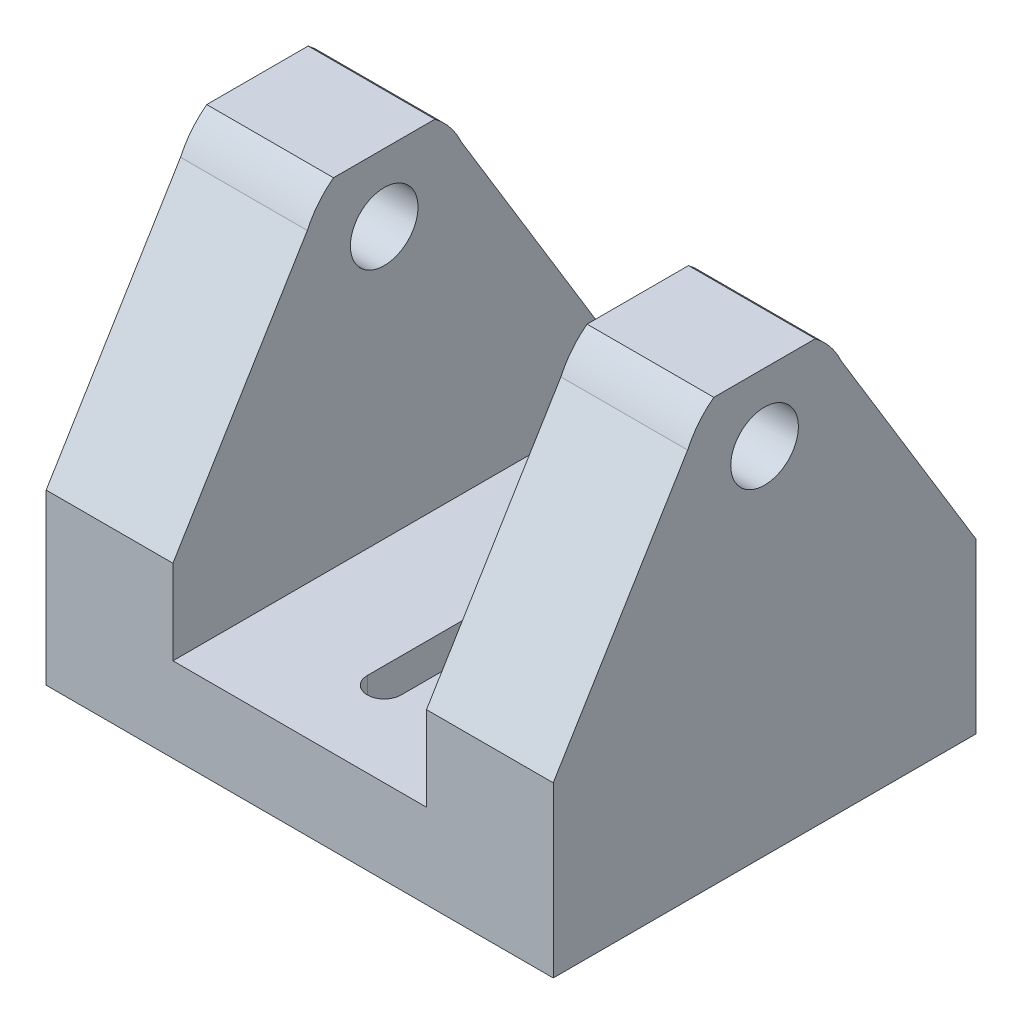
ISO-10303-21;
HEADER;
FILE_DESCRIPTION(('STEP AP214'),'2;1');
FILE_NAME('part.step','',(''),(''),'','','');
FILE_SCHEMA(('AUTOMOTIVE_DESIGN { 1 0 10303 214 1 1 1 1 }'));
ENDSEC;
DATA;
#1=APPLICATION_CONTEXT('core data for automotive mechanical design processes');
#2=APPLICATION_PROTOCOL_DEFINITION('international standard','automotive_design',2000,#1);
#3=PRODUCT_CONTEXT('',#1,'mechanical');
#4=PRODUCT('Part','Part','',(#3));
#5=PRODUCT_RELATED_PRODUCT_CATEGORY('part','',(#4));
#6=PRODUCT_DEFINITION_FORMATION('','',#4);
#7=PRODUCT_DEFINITION_CONTEXT('part definition',#1,'design');
#8=PRODUCT_DEFINITION('design','',#6,#7);
#9=PRODUCT_DEFINITION_SHAPE('','',#8);
#10=(LENGTH_UNIT() NAMED_UNIT(*) SI_UNIT(.MILLI.,.METRE.));
#11=(NAMED_UNIT(*) PLANE_ANGLE_UNIT() SI_UNIT($,.RADIAN.));
#12=(NAMED_UNIT(*) SI_UNIT($,.STERADIAN.) SOLID_ANGLE_UNIT());
#13=UNCERTAINTY_MEASURE_WITH_UNIT(LENGTH_MEASURE(1.E-05),#10,'distance_accuracy_value','');
#14=(GEOMETRIC_REPRESENTATION_CONTEXT(3) GLOBAL_UNCERTAINTY_ASSIGNED_CONTEXT((#13)) GLOBAL_UNIT_ASSIGNED_CONTEXT((#10,
#11,#12)) REPRESENTATION_CONTEXT('',''));
#15=CARTESIAN_POINT('',(0.,0.,0.));
#16=DIRECTION('',(0.,0.,1.));
#17=DIRECTION('',(1.,0.,0.));
#18=AXIS2_PLACEMENT_3D('',#15,#16,#17);
#19=CARTESIAN_POINT('',(0.,63.5,0.));
#20=DIRECTION('',(1.,0.,0.));
#21=DIRECTION('',(0.,0.,-1.));
#22=AXIS2_PLACEMENT_3D('',#19,#20,#21);
#23=PLANE('',#22);
#24=DIRECTION('',(0.,-0.854416285186458,-0.519589079569782));
#25=VECTOR('',#24,1.);
#26=CARTESIAN_POINT('',(0.,35.0478404853786,-57.6329388910934));
#27=LINE('',#26,#25);
#28=CARTESIAN_POINT('',(0.,58.6055247601735,-43.307));
#29=VERTEX_POINT('',#28);
#30=CARTESIAN_POINT('',(0.,25.4,-63.5));
#31=VERTEX_POINT('',#30);
#32=EDGE_CURVE('E286',#29,#31,#27,.T.);
#33=ORIENTED_EDGE('',*,*,#32,.T.);
#34=DIRECTION('',(0.,-1.,0.));
#35=VECTOR('',#34,1.);
#36=CARTESIAN_POINT('',(0.,63.5,-63.5));
#37=LINE('',#36,#35);
#38=CARTESIAN_POINT('',(0.,0.,-63.5));
#39=VERTEX_POINT('',#38);
#40=EDGE_CURVE('E229',#31,#39,#37,.T.);
#41=ORIENTED_EDGE('',*,*,#40,.T.);
#42=DIRECTION('',(0.,0.,1.));
#43=VECTOR('',#42,1.);
#44=CARTESIAN_POINT('',(0.,0.,0.));
#45=LINE('',#44,#43);
#46=CARTESIAN_POINT('',(0.,0.,0.));
#47=VERTEX_POINT('',#46);
#48=EDGE_CURVE('E226',#39,#47,#45,.T.);
#49=ORIENTED_EDGE('',*,*,#48,.T.);
#50=DIRECTION('',(0.,-1.,0.));
#51=VECTOR('',#50,1.);
#52=CARTESIAN_POINT('',(0.,63.5,0.));
#53=LINE('',#52,#51);
#54=CARTESIAN_POINT('',(0.,25.4,0.));
#55=VERTEX_POINT('',#54);
#56=EDGE_CURVE('E239',#55,#47,#53,.T.);
#57=ORIENTED_EDGE('',*,*,#56,.F.);
#58=DIRECTION('',(0.,-0.854416285186458,0.519589079569782));
#59=VECTOR('',#58,1.);
#60=CARTESIAN_POINT('',(0.,6.8573094148476,11.2762124282124));
#61=LINE('',#60,#59);
#62=CARTESIAN_POINT('',(0.,58.6055247601735,-20.193));
#63=VERTEX_POINT('',#62);
#64=EDGE_CURVE('E272',#63,#55,#61,.T.);
#65=ORIENTED_EDGE('',*,*,#64,.F.);
#66=CARTESIAN_POINT('',(0.,53.34,-31.75));
#67=DIRECTION('',(-1.,0.,0.));
#68=DIRECTION('',(0.,0.,1.));
#69=AXIS2_PLACEMENT_3D('',#66,#67,#68);
#70=CIRCLE('',#69,12.7);
#71=CARTESIAN_POINT('',(0.,63.5,-24.13));
#72=VERTEX_POINT('',#71);
#73=EDGE_CURVE('E269',#72,#63,#70,.F.);
#74=ORIENTED_EDGE('',*,*,#73,.F.);
#75=DIRECTION('',(0.,0.,1.));
#76=VECTOR('',#75,1.);
#77=CARTESIAN_POINT('',(0.,63.5,0.));
#78=LINE('',#77,#76);
#79=CARTESIAN_POINT('',(0.,63.5,-39.37));
#80=VERTEX_POINT('',#79);
#81=EDGE_CURVE('E227',#80,#72,#78,.T.);
#82=ORIENTED_EDGE('',*,*,#81,.F.);
#83=CARTESIAN_POINT('',(0.,53.34,-31.75));
#84=DIRECTION('',(-1.,0.,0.));
#85=DIRECTION('',(0.,0.,1.));
#86=AXIS2_PLACEMENT_3D('',#83,#84,#85);
#87=CIRCLE('',#86,12.7);
#88=EDGE_CURVE('E181',#29,#80,#87,.F.);
#89=ORIENTED_EDGE('',*,*,#88,.F.);
#90=EDGE_LOOP('',(#33,#41,#49,#57,#65,#74,#82,#89));
#91=FACE_BOUND('',#90,.T.);
#92=CARTESIAN_POINT('',(0.,53.34,-31.75));
#93=DIRECTION('',(-1.,0.,0.));
#94=DIRECTION('',(0.,0.,1.));
#95=AXIS2_PLACEMENT_3D('',#92,#93,#94);
#96=CIRCLE('',#95,5.08);
#97=CARTESIAN_POINT('',(0.,53.34,-26.67));
#98=VERTEX_POINT('',#97);
#99=EDGE_CURVE('E300',#98,#98,#96,.T.);
#100=ORIENTED_EDGE('',*,*,#99,.F.);
#101=EDGE_LOOP('',(#100));
#102=FACE_BOUND('',#101,.T.);
#103=ADVANCED_FACE('F33',(#91,#102),#23,.F.);
#104=CARTESIAN_POINT('',(0.,63.5,-63.5));
#105=DIRECTION('',(0.,0.,1.));
#106=DIRECTION('',(1.,0.,0.));
#107=AXIS2_PLACEMENT_3D('',#104,#105,#106);
#108=PLANE('',#107);
#109=DIRECTION('',(-1.,0.,0.));
#110=VECTOR('',#109,1.);
#111=CARTESIAN_POINT('',(76.2,25.4,-63.5));
#112=LINE('',#111,#110);
#113=CARTESIAN_POINT('',(76.2,25.4,-63.5));
#114=VERTEX_POINT('',#113);
#115=CARTESIAN_POINT('',(57.15,25.4,-63.5));
#116=VERTEX_POINT('',#115);
#117=EDGE_CURVE('E296',#114,#116,#112,.T.);
#118=ORIENTED_EDGE('',*,*,#117,.F.);
#119=DIRECTION('',(0.,-1.,0.));
#120=VECTOR('',#119,1.);
#121=CARTESIAN_POINT('',(76.2,63.5,-63.5));
#122=LINE('',#121,#120);
#123=CARTESIAN_POINT('',(76.2,0.,-63.5));
#124=VERTEX_POINT('',#123);
#125=EDGE_CURVE('E224',#114,#124,#122,.T.);
#126=ORIENTED_EDGE('',*,*,#125,.T.);
#127=DIRECTION('',(-1.,0.,0.));
#128=VECTOR('',#127,1.);
#129=CARTESIAN_POINT('',(0.,0.,-63.5));
#130=LINE('',#129,#128);
#131=EDGE_CURVE('E230',#124,#39,#130,.T.);
#132=ORIENTED_EDGE('',*,*,#131,.T.);
#133=ORIENTED_EDGE('',*,*,#40,.F.);
#134=CARTESIAN_POINT('',(19.05,25.4,-63.5));
#135=VERTEX_POINT('',#134);
#136=EDGE_CURVE('E341',#135,#31,#112,.T.);
#137=ORIENTED_EDGE('',*,*,#136,.F.);
#138=DIRECTION('',(0.,-1.,0.));
#139=VECTOR('',#138,1.);
#140=CARTESIAN_POINT('',(19.05,63.5,-63.5));
#141=LINE('',#140,#139);
#142=CARTESIAN_POINT('',(19.05,12.7,-63.5));
#143=VERTEX_POINT('',#142);
#144=EDGE_CURVE('E216',#135,#143,#141,.T.);
#145=ORIENTED_EDGE('',*,*,#144,.T.);
#146=DIRECTION('',(-1.,0.,0.));
#147=VECTOR('',#146,1.);
#148=CARTESIAN_POINT('',(57.15,12.7,-63.5));
#149=LINE('',#148,#147);
#150=CARTESIAN_POINT('',(57.15,12.7,-63.5));
#151=VERTEX_POINT('',#150);
#152=EDGE_CURVE('E308',#151,#143,#149,.T.);
#153=ORIENTED_EDGE('',*,*,#152,.F.);
#154=DIRECTION('',(0.,-1.,0.));
#155=VECTOR('',#154,1.);
#156=CARTESIAN_POINT('',(57.15,63.5,-63.5));
#157=LINE('',#156,#155);
#158=EDGE_CURVE('E311',#116,#151,#157,.T.);
#159=ORIENTED_EDGE('',*,*,#158,.F.);
#160=EDGE_LOOP('',(#118,#126,#132,#133,#137,#145,#153,#159));
#161=FACE_BOUND('',#160,.T.);
#162=ADVANCED_FACE('F338',(#161),#108,.F.);
#163=CARTESIAN_POINT('',(76.2,63.5,0.));
#164=DIRECTION('',(1.,0.,0.));
#165=DIRECTION('',(0.,0.,-1.));
#166=AXIS2_PLACEMENT_3D('',#163,#164,#165);
#167=PLANE('',#166);
#168=CARTESIAN_POINT('',(76.2,53.34,-31.75));
#169=DIRECTION('',(-1.,0.,0.));
#170=DIRECTION('',(0.,0.,1.));
#171=AXIS2_PLACEMENT_3D('',#168,#169,#170);
#172=CIRCLE('',#171,5.08);
#173=CARTESIAN_POINT('',(76.2,53.34,-26.67));
#174=VERTEX_POINT('',#173);
#175=EDGE_CURVE('E246',#174,#174,#172,.T.);
#176=ORIENTED_EDGE('',*,*,#175,.T.);
#177=EDGE_LOOP('',(#176));
#178=FACE_BOUND('',#177,.T.);
#179=ORIENTED_EDGE('',*,*,#125,.F.);
#180=DIRECTION('',(0.,-0.854416285186458,-0.519589079569782));
#181=VECTOR('',#180,1.);
#182=CARTESIAN_POINT('',(76.2,35.0478404853786,-57.6329388910934));
#183=LINE('',#182,#181);
#184=CARTESIAN_POINT('',(76.2,58.6055247601735,-43.307));
#185=VERTEX_POINT('',#184);
#186=EDGE_CURVE('E371',#185,#114,#183,.T.);
#187=ORIENTED_EDGE('',*,*,#186,.F.);
#188=CARTESIAN_POINT('',(76.2,53.34,-31.75));
#189=DIRECTION('',(-1.,0.,0.));
#190=DIRECTION('',(0.,0.,1.));
#191=AXIS2_PLACEMENT_3D('',#188,#189,#190);
#192=CIRCLE('',#191,12.7);
#193=CARTESIAN_POINT('',(76.2,63.5,-39.37));
#194=VERTEX_POINT('',#193);
#195=EDGE_CURVE('E373',#185,#194,#192,.F.);
#196=ORIENTED_EDGE('',*,*,#195,.T.);
#197=DIRECTION('',(0.,0.,1.));
#198=VECTOR('',#197,1.);
#199=CARTESIAN_POINT('',(76.2,63.5,0.));
#200=LINE('',#199,#198);
#201=CARTESIAN_POINT('',(76.2,63.5,-24.13));
#202=VERTEX_POINT('',#201);
#203=EDGE_CURVE('E217',#194,#202,#200,.T.);
#204=ORIENTED_EDGE('',*,*,#203,.T.);
#205=CARTESIAN_POINT('',(76.2,53.34,-31.75));
#206=DIRECTION('',(-1.,0.,0.));
#207=DIRECTION('',(0.,0.,1.));
#208=AXIS2_PLACEMENT_3D('',#205,#206,#207);
#209=CIRCLE('',#208,12.7);
#210=CARTESIAN_POINT('',(76.2,58.6055247601735,-20.193));
#211=VERTEX_POINT('',#210);
#212=EDGE_CURVE('E277',#202,#211,#209,.F.);
#213=ORIENTED_EDGE('',*,*,#212,.T.);
#214=DIRECTION('',(0.,-0.854416285186458,0.519589079569782));
#215=VECTOR('',#214,1.);
#216=CARTESIAN_POINT('',(76.2,6.8573094148476,11.2762124282124));
#217=LINE('',#216,#215);
#218=CARTESIAN_POINT('',(76.2,25.4,0.));
#219=VERTEX_POINT('',#218);
#220=EDGE_CURVE('E280',#211,#219,#217,.T.);
#221=ORIENTED_EDGE('',*,*,#220,.T.);
#222=DIRECTION('',(0.,-1.,0.));
#223=VECTOR('',#222,1.);
#224=CARTESIAN_POINT('',(76.2,63.5,0.));
#225=LINE('',#224,#223);
#226=CARTESIAN_POINT('',(76.2,0.,0.));
#227=VERTEX_POINT('',#226);
#228=EDGE_CURVE('E220',#219,#227,#225,.T.);
#229=ORIENTED_EDGE('',*,*,#228,.T.);
#230=DIRECTION('',(0.,0.,1.));
#231=VECTOR('',#230,1.);
#232=CARTESIAN_POINT('',(76.2,0.,0.));
#233=LINE('',#232,#231);
#234=EDGE_CURVE('E207',#124,#227,#233,.T.);
#235=ORIENTED_EDGE('',*,*,#234,.F.);
#236=EDGE_LOOP('',(#179,#187,#196,#204,#213,#221,#229,#235));
#237=FACE_BOUND('',#236,.T.);
#238=ADVANCED_FACE('F368',(#178,#237),#167,.T.);
#239=CARTESIAN_POINT('',(19.05,63.5,-63.5));
#240=DIRECTION('',(-1.,0.,0.));
#241=DIRECTION('',(0.,0.,1.));
#242=AXIS2_PLACEMENT_3D('',#239,#240,#241);
#243=PLANE('',#242);
#244=DIRECTION('',(0.,-0.854416285186458,-0.519589079569782));
#245=VECTOR('',#244,1.);
#246=CARTESIAN_POINT('',(19.05,53.2140358777286,-46.5856813576814));
#247=LINE('',#246,#245);
#248=CARTESIAN_POINT('',(19.05,58.6055247601735,-43.307));
#249=VERTEX_POINT('',#248);
#250=EDGE_CURVE('E197',#249,#135,#247,.T.);
#251=ORIENTED_EDGE('',*,*,#250,.F.);
#252=CARTESIAN_POINT('',(19.05,53.34,-31.75));
#253=DIRECTION('',(-1.,0.,0.));
#254=DIRECTION('',(0.,0.,1.));
#255=AXIS2_PLACEMENT_3D('',#252,#253,#254);
#256=CIRCLE('',#255,12.7);
#257=CARTESIAN_POINT('',(19.05,63.5,-39.37));
#258=VERTEX_POINT('',#257);
#259=EDGE_CURVE('E178',#249,#258,#256,.F.);
#260=ORIENTED_EDGE('',*,*,#259,.T.);
#261=DIRECTION('',(0.,0.,1.));
#262=VECTOR('',#261,1.);
#263=CARTESIAN_POINT('',(19.05,63.5,-63.5));
#264=LINE('',#263,#262);
#265=CARTESIAN_POINT('',(19.05,63.5,-24.13));
#266=VERTEX_POINT('',#265);
#267=EDGE_CURVE('E195',#258,#266,#264,.T.);
#268=ORIENTED_EDGE('',*,*,#267,.T.);
#269=CARTESIAN_POINT('',(19.05,53.34,-31.75));
#270=DIRECTION('',(-1.,0.,0.));
#271=DIRECTION('',(0.,0.,1.));
#272=AXIS2_PLACEMENT_3D('',#269,#270,#271);
#273=CIRCLE('',#272,12.7);
#274=CARTESIAN_POINT('',(19.05,58.6055247601735,-20.193));
#275=VERTEX_POINT('',#274);
#276=EDGE_CURVE('E294',#266,#275,#273,.F.);
#277=ORIENTED_EDGE('',*,*,#276,.T.);
#278=DIRECTION('',(0.,-0.854416285186458,0.519589079569782));
#279=VECTOR('',#278,1.);
#280=CARTESIAN_POINT('',(19.05,81.4045669482596,-34.0575921794376));
#281=LINE('',#280,#279);
#282=CARTESIAN_POINT('',(19.05,25.4,0.));
#283=VERTEX_POINT('',#282);
#284=EDGE_CURVE('E198',#275,#283,#281,.T.);
#285=ORIENTED_EDGE('',*,*,#284,.T.);
#286=DIRECTION('',(0.,-1.,0.));
#287=VECTOR('',#286,1.);
#288=CARTESIAN_POINT('',(19.05,63.5,0.));
#289=LINE('',#288,#287);
#290=CARTESIAN_POINT('',(19.05,12.7,0.));
#291=VERTEX_POINT('',#290);
#292=EDGE_CURVE('E312',#283,#291,#289,.T.);
#293=ORIENTED_EDGE('',*,*,#292,.T.);
#294=DIRECTION('',(0.,0.,1.));
#295=VECTOR('',#294,1.);
#296=CARTESIAN_POINT('',(19.05,12.7,-63.5));
#297=LINE('',#296,#295);
#298=EDGE_CURVE('E203',#143,#291,#297,.T.);
#299=ORIENTED_EDGE('',*,*,#298,.F.);
#300=ORIENTED_EDGE('',*,*,#144,.F.);
#301=EDGE_LOOP('',(#251,#260,#268,#277,#285,#293,#299,#300));
#302=FACE_BOUND('',#301,.T.);
#303=CARTESIAN_POINT('',(19.05,53.34,-31.75));
#304=DIRECTION('',(-1.,0.,0.));
#305=DIRECTION('',(0.,0.,1.));
#306=AXIS2_PLACEMENT_3D('',#303,#304,#305);
#307=CIRCLE('',#306,5.08);
#308=CARTESIAN_POINT('',(19.05,53.34,-26.67));
#309=VERTEX_POINT('',#308);
#310=EDGE_CURVE('E245',#309,#309,#307,.T.);
#311=ORIENTED_EDGE('',*,*,#310,.T.);
#312=EDGE_LOOP('',(#311));
#313=FACE_BOUND('',#312,.T.);
#314=ADVANCED_FACE('F192',(#302,#313),#243,.F.);
#315=CARTESIAN_POINT('',(57.15,63.5,-63.5));
#316=DIRECTION('',(-1.,0.,0.));
#317=DIRECTION('',(0.,0.,1.));
#318=AXIS2_PLACEMENT_3D('',#315,#316,#317);
#319=PLANE('',#318);
#320=CARTESIAN_POINT('',(57.15,53.34,-31.75));
#321=DIRECTION('',(-1.,0.,0.));
#322=DIRECTION('',(0.,0.,1.));
#323=AXIS2_PLACEMENT_3D('',#320,#321,#322);
#324=CIRCLE('',#323,5.08);
#325=CARTESIAN_POINT('',(57.15,53.34,-26.67));
#326=VERTEX_POINT('',#325);
#327=EDGE_CURVE('E242',#326,#326,#324,.T.);
#328=ORIENTED_EDGE('',*,*,#327,.F.);
#329=EDGE_LOOP('',(#328));
#330=FACE_BOUND('',#329,.T.);
#331=CARTESIAN_POINT('',(57.15,53.34,-31.75));
#332=DIRECTION('',(-1.,0.,0.));
#333=DIRECTION('',(0.,0.,1.));
#334=AXIS2_PLACEMENT_3D('',#331,#332,#333);
#335=CIRCLE('',#334,12.7);
#336=CARTESIAN_POINT('',(57.15,58.6055247601735,-43.307));
#337=VERTEX_POINT('',#336);
#338=CARTESIAN_POINT('',(57.15,63.5,-39.37));
#339=VERTEX_POINT('',#338);
#340=EDGE_CURVE('E250',#337,#339,#335,.F.);
#341=ORIENTED_EDGE('',*,*,#340,.F.);
#342=DIRECTION('',(0.,-0.854416285186458,-0.519589079569782));
#343=VECTOR('',#342,1.);
#344=CARTESIAN_POINT('',(57.15,53.2140358777286,-46.5856813576814));
#345=LINE('',#344,#343);
#346=EDGE_CURVE('E252',#337,#116,#345,.T.);
#347=ORIENTED_EDGE('',*,*,#346,.T.);
#348=ORIENTED_EDGE('',*,*,#158,.T.);
#349=DIRECTION('',(0.,0.,1.));
#350=VECTOR('',#349,1.);
#351=CARTESIAN_POINT('',(57.15,12.7,-63.5));
#352=LINE('',#351,#350);
#353=CARTESIAN_POINT('',(57.15,12.7,0.));
#354=VERTEX_POINT('',#353);
#355=EDGE_CURVE('E210',#151,#354,#352,.T.);
#356=ORIENTED_EDGE('',*,*,#355,.T.);
#357=DIRECTION('',(0.,-1.,0.));
#358=VECTOR('',#357,1.);
#359=CARTESIAN_POINT('',(57.15,63.5,0.));
#360=LINE('',#359,#358);
#361=CARTESIAN_POINT('',(57.15,25.4,0.));
#362=VERTEX_POINT('',#361);
#363=EDGE_CURVE('E317',#362,#354,#360,.T.);
#364=ORIENTED_EDGE('',*,*,#363,.F.);
#365=DIRECTION('',(0.,-0.854416285186458,0.519589079569782));
#366=VECTOR('',#365,1.);
#367=CARTESIAN_POINT('',(57.15,81.4045669482596,-34.0575921794376));
#368=LINE('',#367,#366);
#369=CARTESIAN_POINT('',(57.15,58.6055247601735,-20.193));
#370=VERTEX_POINT('',#369);
#371=EDGE_CURVE('E248',#370,#362,#368,.T.);
#372=ORIENTED_EDGE('',*,*,#371,.F.);
#373=CARTESIAN_POINT('',(57.15,53.34,-31.75));
#374=DIRECTION('',(-1.,0.,0.));
#375=DIRECTION('',(0.,0.,1.));
#376=AXIS2_PLACEMENT_3D('',#373,#374,#375);
#377=CIRCLE('',#376,12.7);
#378=CARTESIAN_POINT('',(57.15,63.5,-24.13));
#379=VERTEX_POINT('',#378);
#380=EDGE_CURVE('E241',#379,#370,#377,.F.);
#381=ORIENTED_EDGE('',*,*,#380,.F.);
#382=DIRECTION('',(0.,0.,1.));
#383=VECTOR('',#382,1.);
#384=CARTESIAN_POINT('',(57.15,63.5,-63.5));
#385=LINE('',#384,#383);
#386=EDGE_CURVE('E204',#339,#379,#385,.T.);
#387=ORIENTED_EDGE('',*,*,#386,.F.);
#388=EDGE_LOOP('',(#341,#347,#348,#356,#364,#372,#381,#387));
#389=FACE_BOUND('',#388,.T.);
#390=ADVANCED_FACE('F334',(#330,#389),#319,.T.);
#391=CARTESIAN_POINT('',(0.,63.5,0.));
#392=DIRECTION('',(0.,-1.,0.));
#393=DIRECTION('',(0.,0.,-1.));
#394=AXIS2_PLACEMENT_3D('',#391,#392,#393);
#395=PLANE('',#394);
#396=ORIENTED_EDGE('',*,*,#203,.F.);
#397=DIRECTION('',(-1.,0.,0.));
#398=VECTOR('',#397,1.);
#399=CARTESIAN_POINT('',(76.2,63.5,-39.37));
#400=LINE('',#399,#398);
#401=EDGE_CURVE('E186',#194,#339,#400,.T.);
#402=ORIENTED_EDGE('',*,*,#401,.T.);
#403=ORIENTED_EDGE('',*,*,#386,.T.);
#404=DIRECTION('',(-1.,0.,0.));
#405=VECTOR('',#404,1.);
#406=CARTESIAN_POINT('',(76.2,63.5,-24.13));
#407=LINE('',#406,#405);
#408=EDGE_CURVE('E292',#202,#379,#407,.T.);
#409=ORIENTED_EDGE('',*,*,#408,.F.);
#410=EDGE_LOOP('',(#396,#402,#403,#409));
#411=FACE_BOUND('',#410,.T.);
#412=ADVANCED_FACE('F409',(#411),#395,.F.);
#413=CARTESIAN_POINT('',(0.,63.5,0.));
#414=DIRECTION('',(0.,0.,-1.));
#415=DIRECTION('',(-1.,0.,0.));
#416=AXIS2_PLACEMENT_3D('',#413,#414,#415);
#417=PLANE('',#416);
#418=ORIENTED_EDGE('',*,*,#228,.F.);
#419=DIRECTION('',(-1.,0.,0.));
#420=VECTOR('',#419,1.);
#421=CARTESIAN_POINT('',(76.2,25.4,0.));
#422=LINE('',#421,#420);
#423=EDGE_CURVE('E283',#219,#362,#422,.T.);
#424=ORIENTED_EDGE('',*,*,#423,.T.);
#425=ORIENTED_EDGE('',*,*,#363,.T.);
#426=DIRECTION('',(-1.,0.,0.));
#427=VECTOR('',#426,1.);
#428=CARTESIAN_POINT('',(57.15,12.7,0.));
#429=LINE('',#428,#427);
#430=EDGE_CURVE('E307',#354,#291,#429,.T.);
#431=ORIENTED_EDGE('',*,*,#430,.T.);
#432=ORIENTED_EDGE('',*,*,#292,.F.);
#433=EDGE_CURVE('E287',#283,#55,#422,.T.);
#434=ORIENTED_EDGE('',*,*,#433,.T.);
#435=ORIENTED_EDGE('',*,*,#56,.T.);
#436=DIRECTION('',(1.,0.,0.));
#437=VECTOR('',#436,1.);
#438=CARTESIAN_POINT('',(0.,0.,0.));
#439=LINE('',#438,#437);
#440=EDGE_CURVE('E233',#47,#227,#439,.T.);
#441=ORIENTED_EDGE('',*,*,#440,.T.);
#442=EDGE_LOOP('',(#418,#424,#425,#431,#432,#434,#435,#441));
#443=FACE_BOUND('',#442,.T.);
#444=ADVANCED_FACE('F329',(#443),#417,.F.);
#445=ORIENTED_EDGE('',*,*,#267,.F.);
#446=EDGE_CURVE('E175',#258,#80,#400,.T.);
#447=ORIENTED_EDGE('',*,*,#446,.T.);
#448=ORIENTED_EDGE('',*,*,#81,.T.);
#449=EDGE_CURVE('E202',#266,#72,#407,.T.);
#450=ORIENTED_EDGE('',*,*,#449,.F.);
#451=EDGE_LOOP('',(#445,#447,#448,#450));
#452=FACE_BOUND('',#451,.T.);
#453=ADVANCED_FACE('F201',(#452),#395,.F.);
#454=CARTESIAN_POINT('',(0.,0.,0.));
#455=DIRECTION('',(0.,-1.,0.));
#456=DIRECTION('',(0.,0.,-1.));
#457=AXIS2_PLACEMENT_3D('',#454,#455,#456);
#458=PLANE('',#457);
#459=DIRECTION('',(0.,0.,-1.));
#460=VECTOR('',#459,1.);
#461=CARTESIAN_POINT('',(40.64,0.,-50.7999999999999));
#462=LINE('',#461,#460);
#463=CARTESIAN_POINT('',(40.64,0.,-50.7999999999999));
#464=VERTEX_POINT('',#463);
#465=CARTESIAN_POINT('',(40.64,0.,-12.7));
#466=VERTEX_POINT('',#465);
#467=EDGE_CURVE('E36',#464,#466,#462,.F.);
#468=ORIENTED_EDGE('',*,*,#467,.F.);
#469=CARTESIAN_POINT('',(38.1,0.,-50.7999999999999));
#470=DIRECTION('',(0.,-1.,0.));
#471=DIRECTION('',(0.,0.,-1.));
#472=AXIS2_PLACEMENT_3D('',#469,#470,#471);
#473=CIRCLE('',#472,2.54);
#474=CARTESIAN_POINT('',(35.56,0.,-50.7999999999999));
#475=VERTEX_POINT('',#474);
#476=EDGE_CURVE('E76',#464,#475,#473,.F.);
#477=ORIENTED_EDGE('',*,*,#476,.T.);
#478=DIRECTION('',(0.,0.,-1.));
#479=VECTOR('',#478,1.);
#480=CARTESIAN_POINT('',(35.56,0.,0.));
#481=LINE('',#480,#479);
#482=CARTESIAN_POINT('',(35.56,0.,-12.7));
#483=VERTEX_POINT('',#482);
#484=EDGE_CURVE('E264',#475,#483,#481,.F.);
#485=ORIENTED_EDGE('',*,*,#484,.T.);
#486=CARTESIAN_POINT('',(38.1,0.,-12.7));
#487=DIRECTION('',(0.,-1.,0.));
#488=DIRECTION('',(0.,0.,-1.));
#489=AXIS2_PLACEMENT_3D('',#486,#487,#488);
#490=CIRCLE('',#489,2.54);
#491=EDGE_CURVE('E262',#466,#483,#490,.T.);
#492=ORIENTED_EDGE('',*,*,#491,.F.);
#493=EDGE_LOOP('',(#468,#477,#485,#492));
#494=FACE_BOUND('',#493,.T.);
#495=ORIENTED_EDGE('',*,*,#131,.F.);
#496=ORIENTED_EDGE('',*,*,#234,.T.);
#497=ORIENTED_EDGE('',*,*,#440,.F.);
#498=ORIENTED_EDGE('',*,*,#48,.F.);
#499=EDGE_LOOP('',(#495,#496,#497,#498));
#500=FACE_BOUND('',#499,.T.);
#501=ADVANCED_FACE('F365',(#494,#500),#458,.T.);
#502=CARTESIAN_POINT('',(57.15,12.7,-63.5));
#503=DIRECTION('',(0.,1.,0.));
#504=DIRECTION('',(0.,0.,1.));
#505=AXIS2_PLACEMENT_3D('',#502,#503,#504);
#506=PLANE('',#505);
#507=DIRECTION('',(0.,0.,-1.));
#508=VECTOR('',#507,1.);
#509=CARTESIAN_POINT('',(40.64,12.7,-63.5));
#510=LINE('',#509,#508);
#511=CARTESIAN_POINT('',(40.64,12.7,-12.7));
#512=VERTEX_POINT('',#511);
#513=CARTESIAN_POINT('',(40.64,12.7,-50.7999999999999));
#514=VERTEX_POINT('',#513);
#515=EDGE_CURVE('E11',#512,#514,#510,.T.);
#516=ORIENTED_EDGE('',*,*,#515,.F.);
#517=CARTESIAN_POINT('',(38.1,12.7,-12.7));
#518=DIRECTION('',(0.,1.,0.));
#519=DIRECTION('',(0.,0.,1.));
#520=AXIS2_PLACEMENT_3D('',#517,#518,#519);
#521=CIRCLE('',#520,2.54);
#522=CARTESIAN_POINT('',(35.56,12.7,-12.7));
#523=VERTEX_POINT('',#522);
#524=EDGE_CURVE('E255',#523,#512,#521,.T.);
#525=ORIENTED_EDGE('',*,*,#524,.F.);
#526=DIRECTION('',(0.,0.,-1.));
#527=VECTOR('',#526,1.);
#528=CARTESIAN_POINT('',(35.56,12.7,-63.5));
#529=LINE('',#528,#527);
#530=CARTESIAN_POINT('',(35.56,12.7,-50.7999999999999));
#531=VERTEX_POINT('',#530);
#532=EDGE_CURVE('E257',#523,#531,#529,.T.);
#533=ORIENTED_EDGE('',*,*,#532,.T.);
#534=CARTESIAN_POINT('',(38.1,12.7,-50.7999999999999));
#535=DIRECTION('',(0.,1.,0.));
#536=DIRECTION('',(0.,0.,1.));
#537=AXIS2_PLACEMENT_3D('',#534,#535,#536);
#538=CIRCLE('',#537,2.54);
#539=EDGE_CURVE('E41',#531,#514,#538,.F.);
#540=ORIENTED_EDGE('',*,*,#539,.T.);
#541=EDGE_LOOP('',(#516,#525,#533,#540));
#542=FACE_BOUND('',#541,.T.);
#543=ORIENTED_EDGE('',*,*,#430,.F.);
#544=ORIENTED_EDGE('',*,*,#355,.F.);
#545=ORIENTED_EDGE('',*,*,#152,.T.);
#546=ORIENTED_EDGE('',*,*,#298,.T.);
#547=EDGE_LOOP('',(#543,#544,#545,#546));
#548=FACE_BOUND('',#547,.T.);
#549=ADVANCED_FACE('F325',(#542,#548),#506,.T.);
#550=CARTESIAN_POINT('',(76.2,53.34,-31.75));
#551=DIRECTION('',(-1.,0.,0.));
#552=DIRECTION('',(0.,0.,1.));
#553=AXIS2_PLACEMENT_3D('',#550,#551,#552);
#554=CYLINDRICAL_SURFACE('',#553,5.08);
#555=ORIENTED_EDGE('',*,*,#327,.T.);
#556=EDGE_LOOP('',(#555));
#557=FACE_BOUND('',#556,.T.);
#558=ORIENTED_EDGE('',*,*,#175,.F.);
#559=EDGE_LOOP('',(#558));
#560=FACE_BOUND('',#559,.T.);
#561=ADVANCED_FACE('F422',(#557,#560),#554,.F.);
#562=ORIENTED_EDGE('',*,*,#99,.T.);
#563=EDGE_LOOP('',(#562));
#564=FACE_BOUND('',#563,.T.);
#565=ORIENTED_EDGE('',*,*,#310,.F.);
#566=EDGE_LOOP('',(#565));
#567=FACE_BOUND('',#566,.T.);
#568=ADVANCED_FACE('F429',(#564,#567),#554,.F.);
#569=CARTESIAN_POINT('',(76.2,53.34,-31.75));
#570=DIRECTION('',(-1.,0.,0.));
#571=DIRECTION('',(0.,0.,1.));
#572=AXIS2_PLACEMENT_3D('',#569,#570,#571);
#573=CYLINDRICAL_SURFACE('',#572,12.7);
#574=ORIENTED_EDGE('',*,*,#380,.T.);
#575=DIRECTION('',(-1.,0.,0.));
#576=VECTOR('',#575,1.);
#577=CARTESIAN_POINT('',(76.2,58.6055247601735,-20.193));
#578=LINE('',#577,#576);
#579=EDGE_CURVE('E288',#211,#370,#578,.T.);
#580=ORIENTED_EDGE('',*,*,#579,.F.);
#581=ORIENTED_EDGE('',*,*,#212,.F.);
#582=ORIENTED_EDGE('',*,*,#408,.T.);
#583=EDGE_LOOP('',(#574,#580,#581,#582));
#584=FACE_BOUND('',#583,.T.);
#585=ADVANCED_FACE('F431',(#584),#573,.T.);
#586=CARTESIAN_POINT('',(76.2,6.8573094148476,11.2762124282124));
#587=DIRECTION('',(0.,-0.519589079569782,-0.854416285186458));
#588=DIRECTION('',(0.,0.854416285186458,-0.519589079569782));
#589=AXIS2_PLACEMENT_3D('',#586,#587,#588);
#590=PLANE('',#589);
#591=ORIENTED_EDGE('',*,*,#371,.T.);
#592=ORIENTED_EDGE('',*,*,#423,.F.);
#593=ORIENTED_EDGE('',*,*,#220,.F.);
#594=ORIENTED_EDGE('',*,*,#579,.T.);
#595=EDGE_LOOP('',(#591,#592,#593,#594));
#596=FACE_BOUND('',#595,.T.);
#597=ADVANCED_FACE('F434',(#596),#590,.F.);
#598=CARTESIAN_POINT('',(76.2,53.34,-31.75));
#599=DIRECTION('',(-1.,0.,0.));
#600=DIRECTION('',(0.,0.,1.));
#601=AXIS2_PLACEMENT_3D('',#598,#599,#600);
#602=CYLINDRICAL_SURFACE('',#601,12.7);
#603=ORIENTED_EDGE('',*,*,#340,.T.);
#604=ORIENTED_EDGE('',*,*,#401,.F.);
#605=ORIENTED_EDGE('',*,*,#195,.F.);
#606=DIRECTION('',(-1.,0.,0.));
#607=VECTOR('',#606,1.);
#608=CARTESIAN_POINT('',(76.2,58.6055247601735,-43.307));
#609=LINE('',#608,#607);
#610=EDGE_CURVE('E187',#185,#337,#609,.T.);
#611=ORIENTED_EDGE('',*,*,#610,.T.);
#612=EDGE_LOOP('',(#603,#604,#605,#611));
#613=FACE_BOUND('',#612,.T.);
#614=ADVANCED_FACE('F438',(#613),#602,.T.);
#615=CARTESIAN_POINT('',(76.2,35.0478404853786,-57.6329388910934));
#616=DIRECTION('',(0.,0.519589079569782,-0.854416285186458));
#617=DIRECTION('',(0.,0.854416285186458,0.519589079569782));
#618=AXIS2_PLACEMENT_3D('',#615,#616,#617);
#619=PLANE('',#618);
#620=ORIENTED_EDGE('',*,*,#610,.F.);
#621=ORIENTED_EDGE('',*,*,#186,.T.);
#622=ORIENTED_EDGE('',*,*,#117,.T.);
#623=ORIENTED_EDGE('',*,*,#346,.F.);
#624=EDGE_LOOP('',(#620,#621,#622,#623));
#625=FACE_BOUND('',#624,.T.);
#626=ADVANCED_FACE('F440',(#625),#619,.T.);
#627=EDGE_CURVE('E291',#275,#63,#578,.T.);
#628=ORIENTED_EDGE('',*,*,#627,.T.);
#629=ORIENTED_EDGE('',*,*,#64,.T.);
#630=ORIENTED_EDGE('',*,*,#433,.F.);
#631=ORIENTED_EDGE('',*,*,#284,.F.);
#632=EDGE_LOOP('',(#628,#629,#630,#631));
#633=FACE_BOUND('',#632,.T.);
#634=ADVANCED_FACE('F360',(#633),#590,.F.);
#635=ORIENTED_EDGE('',*,*,#449,.T.);
#636=ORIENTED_EDGE('',*,*,#73,.T.);
#637=ORIENTED_EDGE('',*,*,#627,.F.);
#638=ORIENTED_EDGE('',*,*,#276,.F.);
#639=EDGE_LOOP('',(#635,#636,#637,#638));
#640=FACE_BOUND('',#639,.T.);
#641=ADVANCED_FACE('F355',(#640),#573,.T.);
#642=ORIENTED_EDGE('',*,*,#250,.T.);
#643=ORIENTED_EDGE('',*,*,#136,.T.);
#644=ORIENTED_EDGE('',*,*,#32,.F.);
#645=EDGE_CURVE('E350',#249,#29,#609,.T.);
#646=ORIENTED_EDGE('',*,*,#645,.F.);
#647=EDGE_LOOP('',(#642,#643,#644,#646));
#648=FACE_BOUND('',#647,.T.);
#649=ADVANCED_FACE('F443',(#648),#619,.T.);
#650=ORIENTED_EDGE('',*,*,#645,.T.);
#651=ORIENTED_EDGE('',*,*,#88,.T.);
#652=ORIENTED_EDGE('',*,*,#446,.F.);
#653=ORIENTED_EDGE('',*,*,#259,.F.);
#654=EDGE_LOOP('',(#650,#651,#652,#653));
#655=FACE_BOUND('',#654,.T.);
#656=ADVANCED_FACE('F177',(#655),#602,.T.);
#657=CARTESIAN_POINT('',(40.64,63.5,-50.7999999999999));
#658=DIRECTION('',(1.,0.,0.));
#659=DIRECTION('',(0.,0.,-1.));
#660=AXIS2_PLACEMENT_3D('',#657,#658,#659);
#661=PLANE('',#660);
#662=ORIENTED_EDGE('',*,*,#467,.T.);
#663=DIRECTION('',(0.,-1.,0.));
#664=VECTOR('',#663,1.);
#665=CARTESIAN_POINT('',(40.64,63.5,-12.7));
#666=LINE('',#665,#664);
#667=EDGE_CURVE('E49',#512,#466,#666,.T.);
#668=ORIENTED_EDGE('',*,*,#667,.F.);
#669=ORIENTED_EDGE('',*,*,#515,.T.);
#670=DIRECTION('',(0.,-1.,0.));
#671=VECTOR('',#670,1.);
#672=CARTESIAN_POINT('',(40.64,63.5,-50.7999999999999));
#673=LINE('',#672,#671);
#674=EDGE_CURVE('E265',#514,#464,#673,.T.);
#675=ORIENTED_EDGE('',*,*,#674,.T.);
#676=EDGE_LOOP('',(#662,#668,#669,#675));
#677=FACE_BOUND('',#676,.T.);
#678=ADVANCED_FACE('F446',(#677),#661,.F.);
#679=CARTESIAN_POINT('',(38.1,63.5,-50.7999999999999));
#680=DIRECTION('',(0.,-1.,0.));
#681=DIRECTION('',(0.,0.,-1.));
#682=AXIS2_PLACEMENT_3D('',#679,#680,#681);
#683=CYLINDRICAL_SURFACE('',#682,2.54);
#684=ORIENTED_EDGE('',*,*,#674,.F.);
#685=ORIENTED_EDGE('',*,*,#539,.F.);
#686=DIRECTION('',(0.,-1.,0.));
#687=VECTOR('',#686,1.);
#688=CARTESIAN_POINT('',(35.56,63.5,-50.7999999999999));
#689=LINE('',#688,#687);
#690=EDGE_CURVE('E380',#531,#475,#689,.T.);
#691=ORIENTED_EDGE('',*,*,#690,.T.);
#692=ORIENTED_EDGE('',*,*,#476,.F.);
#693=EDGE_LOOP('',(#684,#685,#691,#692));
#694=FACE_BOUND('',#693,.T.);
#695=ADVANCED_FACE('F393',(#694),#683,.F.);
#696=CARTESIAN_POINT('',(35.56,63.5,-50.7999999999999));
#697=DIRECTION('',(1.,0.,0.));
#698=DIRECTION('',(0.,0.,-1.));
#699=AXIS2_PLACEMENT_3D('',#696,#697,#698);
#700=PLANE('',#699);
#701=ORIENTED_EDGE('',*,*,#690,.F.);
#702=ORIENTED_EDGE('',*,*,#532,.F.);
#703=DIRECTION('',(0.,-1.,0.));
#704=VECTOR('',#703,1.);
#705=CARTESIAN_POINT('',(35.56,63.5,-12.7));
#706=LINE('',#705,#704);
#707=EDGE_CURVE('E55',#523,#483,#706,.T.);
#708=ORIENTED_EDGE('',*,*,#707,.T.);
#709=ORIENTED_EDGE('',*,*,#484,.F.);
#710=EDGE_LOOP('',(#701,#702,#708,#709));
#711=FACE_BOUND('',#710,.T.);
#712=ADVANCED_FACE('F385',(#711),#700,.T.);
#713=CARTESIAN_POINT('',(38.1,63.5,-12.7));
#714=DIRECTION('',(0.,-1.,0.));
#715=DIRECTION('',(0.,0.,-1.));
#716=AXIS2_PLACEMENT_3D('',#713,#714,#715);
#717=CYLINDRICAL_SURFACE('',#716,2.54);
#718=ORIENTED_EDGE('',*,*,#491,.T.);
#719=ORIENTED_EDGE('',*,*,#707,.F.);
#720=ORIENTED_EDGE('',*,*,#524,.T.);
#721=ORIENTED_EDGE('',*,*,#667,.T.);
#722=EDGE_LOOP('',(#718,#719,#720,#721));
#723=FACE_BOUND('',#722,.T.);
#724=ADVANCED_FACE('F387',(#723),#717,.F.);
#725=CLOSED_SHELL('',(#103,#162,#238,#314,#390,#412,#444,#453,#501,#549,#561,#568,#585,#597,
#614,#626,#634,#641,#649,#656,#678,#695,#712,#724));
#726=MANIFOLD_SOLID_BREP('B2',#725);
#727=ADVANCED_BREP_SHAPE_REPRESENTATION('',(#18,#726),#14);
#728=SHAPE_DEFINITION_REPRESENTATION(#9,#727);
ENDSEC;
END-ISO-10303-21;
